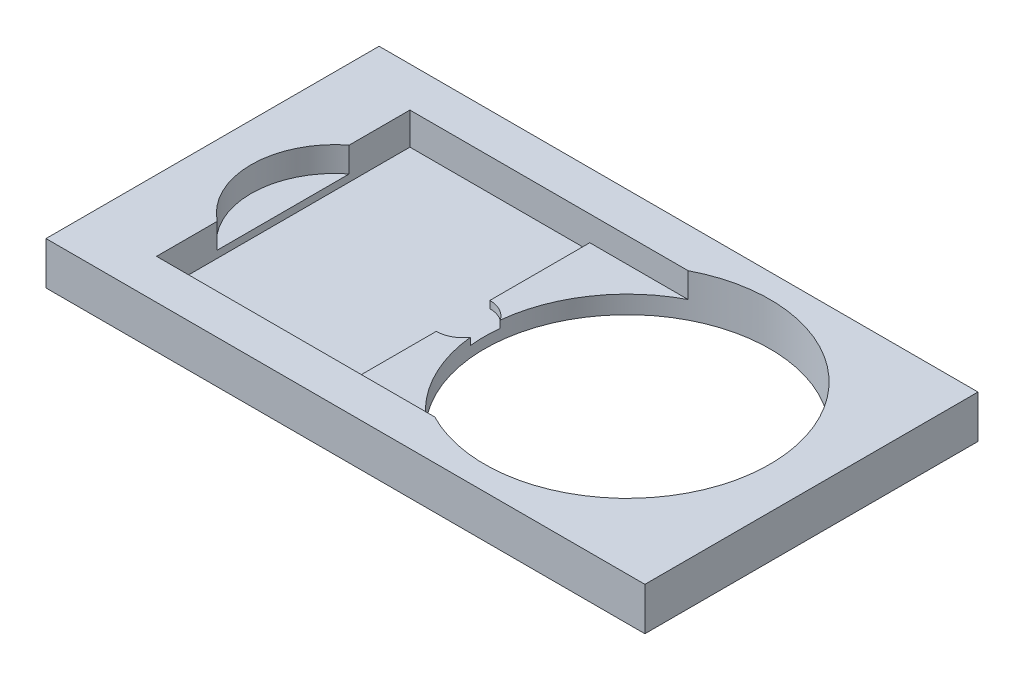
ISO-10303-21;
HEADER;
FILE_DESCRIPTION(('STEP AP214'),'2;1');
FILE_NAME('part.step','',(''),(''),'','','');
FILE_SCHEMA(('AUTOMOTIVE_DESIGN { 1 0 10303 214 1 1 1 1 }'));
ENDSEC;
DATA;
#1=APPLICATION_CONTEXT('core data for automotive mechanical design processes');
#2=APPLICATION_PROTOCOL_DEFINITION('international standard','automotive_design',2000,#1);
#3=PRODUCT_CONTEXT('',#1,'mechanical');
#4=PRODUCT('Part','Part','',(#3));
#5=PRODUCT_RELATED_PRODUCT_CATEGORY('part','',(#4));
#6=PRODUCT_DEFINITION_FORMATION('','',#4);
#7=PRODUCT_DEFINITION_CONTEXT('part definition',#1,'design');
#8=PRODUCT_DEFINITION('design','',#6,#7);
#9=PRODUCT_DEFINITION_SHAPE('','',#8);
#10=(LENGTH_UNIT() NAMED_UNIT(*) SI_UNIT(.MILLI.,.METRE.));
#11=(NAMED_UNIT(*) PLANE_ANGLE_UNIT() SI_UNIT($,.RADIAN.));
#12=(NAMED_UNIT(*) SI_UNIT($,.STERADIAN.) SOLID_ANGLE_UNIT());
#13=UNCERTAINTY_MEASURE_WITH_UNIT(LENGTH_MEASURE(1.E-05),#10,'distance_accuracy_value','');
#14=(GEOMETRIC_REPRESENTATION_CONTEXT(3) GLOBAL_UNCERTAINTY_ASSIGNED_CONTEXT((#13)) GLOBAL_UNIT_ASSIGNED_CONTEXT((#10,
#11,#12)) REPRESENTATION_CONTEXT('',''));
#15=CARTESIAN_POINT('',(0.,0.,0.));
#16=DIRECTION('',(0.,0.,1.));
#17=DIRECTION('',(1.,0.,0.));
#18=AXIS2_PLACEMENT_3D('',#15,#16,#17);
#19=CARTESIAN_POINT('',(0.,3.,0.));
#20=DIRECTION('',(0.,1.,0.));
#21=DIRECTION('',(0.,0.,1.));
#22=AXIS2_PLACEMENT_3D('',#19,#20,#21);
#23=PLANE('',#22);
#24=DIRECTION('',(-1.,0.,0.));
#25=VECTOR('',#24,1.);
#26=CARTESIAN_POINT('',(-10.1000000000001,3.00000000000001,-8.87500000000001));
#27=LINE('',#26,#25);
#28=CARTESIAN_POINT('',(-4.60807714779167,3.00000000000001,-8.875));
#29=VERTEX_POINT('',#28);
#30=CARTESIAN_POINT('',(-24.1000000000001,3.00000000000001,-8.87500000000001));
#31=VERTEX_POINT('',#30);
#32=EDGE_CURVE('E219',#29,#31,#27,.T.);
#33=ORIENTED_EDGE('',*,*,#32,.F.);
#34=CARTESIAN_POINT('',(0.,3.,0.));
#35=DIRECTION('',(0.,1.,0.));
#36=DIRECTION('',(0.,0.,1.));
#37=AXIS2_PLACEMENT_3D('',#34,#35,#36);
#38=CIRCLE('',#37,10.);
#39=CARTESIAN_POINT('',(-4.60807714779169,3.00000000000001,8.875));
#40=VERTEX_POINT('',#39);
#41=EDGE_CURVE('E254',#40,#29,#38,.T.);
#42=ORIENTED_EDGE('',*,*,#41,.F.);
#43=DIRECTION('',(-1.,0.,0.));
#44=VECTOR('',#43,1.);
#45=CARTESIAN_POINT('',(-10.1000000000001,3.00000000000001,8.875));
#46=LINE('',#45,#44);
#47=CARTESIAN_POINT('',(-24.1000000000001,3.00000000000001,8.87499999999999));
#48=VERTEX_POINT('',#47);
#49=EDGE_CURVE('E230',#40,#48,#46,.T.);
#50=ORIENTED_EDGE('',*,*,#49,.T.);
#51=DIRECTION('',(0.,0.,-1.));
#52=VECTOR('',#51,1.);
#53=CARTESIAN_POINT('',(-24.1000000000001,3.00000000000001,0.));
#54=LINE('',#53,#52);
#55=CARTESIAN_POINT('',(-24.1000000000001,3.00000000000001,4.62499999999999));
#56=VERTEX_POINT('',#55);
#57=EDGE_CURVE('E233',#48,#56,#54,.T.);
#58=ORIENTED_EDGE('',*,*,#57,.T.);
#59=CARTESIAN_POINT('',(-20.4715277777778,3.00000000000001,0.));
#60=DIRECTION('',(0.,-1.,0.));
#61=DIRECTION('',(-1.,0.,0.));
#62=AXIS2_PLACEMENT_3D('',#59,#60,#61);
#63=CIRCLE('',#62,5.87847222222222);
#64=CARTESIAN_POINT('',(-24.1000000000001,3.00000000000001,-4.62500000000001));
#65=VERTEX_POINT('',#64);
#66=EDGE_CURVE('E236',#65,#56,#63,.F.);
#67=ORIENTED_EDGE('',*,*,#66,.F.);
#68=DIRECTION('',(0.,0.,-1.));
#69=VECTOR('',#68,1.);
#70=CARTESIAN_POINT('',(-24.1000000000001,3.00000000000001,0.));
#71=LINE('',#70,#69);
#72=EDGE_CURVE('E223',#65,#31,#71,.T.);
#73=ORIENTED_EDGE('',*,*,#72,.T.);
#74=EDGE_LOOP('',(#33,#42,#50,#58,#67,#73));
#75=FACE_BOUND('',#74,.T.);
#76=DIRECTION('',(-1.,0.,0.));
#77=VECTOR('',#76,1.);
#78=CARTESIAN_POINT('',(0.,3.,-11.667703006113));
#79=LINE('',#78,#77);
#80=CARTESIAN_POINT('',(12.9045820912385,3.,-11.667703006113));
#81=VERTEX_POINT('',#80);
#82=CARTESIAN_POINT('',(-29.0510789574431,3.,-11.667703006113));
#83=VERTEX_POINT('',#82);
#84=EDGE_CURVE('E156',#81,#83,#79,.T.);
#85=ORIENTED_EDGE('',*,*,#84,.T.);
#86=DIRECTION('',(0.,0.,1.));
#87=VECTOR('',#86,1.);
#88=CARTESIAN_POINT('',(-29.0510789574431,3.,0.));
#89=LINE('',#88,#87);
#90=CARTESIAN_POINT('',(-29.0510789574431,3.,11.667703006113));
#91=VERTEX_POINT('',#90);
#92=EDGE_CURVE('E181',#83,#91,#89,.T.);
#93=ORIENTED_EDGE('',*,*,#92,.T.);
#94=DIRECTION('',(1.,0.,0.));
#95=VECTOR('',#94,1.);
#96=CARTESIAN_POINT('',(0.,3.,11.667703006113));
#97=LINE('',#96,#95);
#98=CARTESIAN_POINT('',(12.9045820912385,3.,11.667703006113));
#99=VERTEX_POINT('',#98);
#100=EDGE_CURVE('E173',#91,#99,#97,.T.);
#101=ORIENTED_EDGE('',*,*,#100,.T.);
#102=DIRECTION('',(0.,0.,-1.));
#103=VECTOR('',#102,1.);
#104=CARTESIAN_POINT('',(12.9045820912385,3.,0.));
#105=LINE('',#104,#103);
#106=EDGE_CURVE('E178',#99,#81,#105,.T.);
#107=ORIENTED_EDGE('',*,*,#106,.T.);
#108=EDGE_LOOP('',(#85,#93,#101,#107));
#109=FACE_BOUND('',#108,.T.);
#110=ADVANCED_FACE('F35',(#75,#109),#23,.T.);
#111=CARTESIAN_POINT('',(0.,0.,0.));
#112=DIRECTION('',(0.,1.,0.));
#113=DIRECTION('',(0.,0.,1.));
#114=AXIS2_PLACEMENT_3D('',#111,#112,#113);
#115=PLANE('',#114);
#116=CARTESIAN_POINT('',(0.,0.,0.));
#117=DIRECTION('',(0.,1.,0.));
#118=DIRECTION('',(0.,0.,1.));
#119=AXIS2_PLACEMENT_3D('',#116,#117,#118);
#120=CIRCLE('',#119,10.);
#121=CARTESIAN_POINT('',(0.,0.,10.));
#122=VERTEX_POINT('',#121);
#123=EDGE_CURVE('E253',#122,#122,#120,.T.);
#124=ORIENTED_EDGE('',*,*,#123,.T.);
#125=EDGE_LOOP('',(#124));
#126=FACE_BOUND('',#125,.T.);
#127=DIRECTION('',(0.,0.,1.));
#128=VECTOR('',#127,1.);
#129=CARTESIAN_POINT('',(-29.0510789574431,0.,-11.667703006113));
#130=LINE('',#129,#128);
#131=CARTESIAN_POINT('',(-29.0510789574431,0.,-11.667703006113));
#132=VERTEX_POINT('',#131);
#133=CARTESIAN_POINT('',(-29.0510789574431,0.,11.667703006113));
#134=VERTEX_POINT('',#133);
#135=EDGE_CURVE('E58',#132,#134,#130,.T.);
#136=ORIENTED_EDGE('',*,*,#135,.F.);
#137=DIRECTION('',(-1.,0.,0.));
#138=VECTOR('',#137,1.);
#139=CARTESIAN_POINT('',(12.9045820912385,0.,-11.667703006113));
#140=LINE('',#139,#138);
#141=CARTESIAN_POINT('',(12.9045820912385,0.,-11.667703006113));
#142=VERTEX_POINT('',#141);
#143=EDGE_CURVE('E154',#142,#132,#140,.T.);
#144=ORIENTED_EDGE('',*,*,#143,.F.);
#145=DIRECTION('',(0.,0.,-1.));
#146=VECTOR('',#145,1.);
#147=CARTESIAN_POINT('',(12.9045820912385,0.,-11.667703006113));
#148=LINE('',#147,#146);
#149=CARTESIAN_POINT('',(12.9045820912385,0.,11.667703006113));
#150=VERTEX_POINT('',#149);
#151=EDGE_CURVE('E162',#150,#142,#148,.T.);
#152=ORIENTED_EDGE('',*,*,#151,.F.);
#153=DIRECTION('',(1.,0.,0.));
#154=VECTOR('',#153,1.);
#155=CARTESIAN_POINT('',(12.9045820912385,0.,11.667703006113));
#156=LINE('',#155,#154);
#157=EDGE_CURVE('E166',#134,#150,#156,.T.);
#158=ORIENTED_EDGE('',*,*,#157,.F.);
#159=EDGE_LOOP('',(#136,#144,#152,#158));
#160=FACE_BOUND('',#159,.T.);
#161=ADVANCED_FACE('F37',(#126,#160),#115,.F.);
#162=CARTESIAN_POINT('',(0.,3.,0.));
#163=DIRECTION('',(0.,-1.,0.));
#164=DIRECTION('',(0.,0.,-1.));
#165=AXIS2_PLACEMENT_3D('',#162,#163,#164);
#166=CYLINDRICAL_SURFACE('',#165,10.);
#167=DIRECTION('',(0.,-1.,0.));
#168=VECTOR('',#167,1.);
#169=CARTESIAN_POINT('',(-4.60807714779167,3.,-8.87500000000001));
#170=LINE('',#169,#168);
#171=CARTESIAN_POINT('',(-4.60807714779167,1.25000000000001,-8.875));
#172=VERTEX_POINT('',#171);
#173=EDGE_CURVE('E11',#172,#29,#170,.F.);
#174=ORIENTED_EDGE('',*,*,#173,.F.);
#175=CARTESIAN_POINT('',(0.,1.25000000000001,0.));
#176=DIRECTION('',(0.,-1.,0.));
#177=DIRECTION('',(1.,0.,0.));
#178=AXIS2_PLACEMENT_3D('',#175,#176,#177);
#179=CIRCLE('',#178,10.);
#180=CARTESIAN_POINT('',(-9.94497282608697,1.25000000000001,-1.04762373416787));
#181=VERTEX_POINT('',#180);
#182=EDGE_CURVE('E266',#181,#172,#179,.T.);
#183=ORIENTED_EDGE('',*,*,#182,.F.);
#184=DIRECTION('',(0.,1.,0.));
#185=VECTOR('',#184,1.);
#186=CARTESIAN_POINT('',(-9.94497282608697,1.00000000000001,-1.04762373416787));
#187=LINE('',#186,#185);
#188=CARTESIAN_POINT('',(-9.94497282608697,0.750000000000011,-1.04762373416787));
#189=VERTEX_POINT('',#188);
#190=EDGE_CURVE('E263',#181,#189,#187,.F.);
#191=ORIENTED_EDGE('',*,*,#190,.T.);
#192=CARTESIAN_POINT('',(0.,0.750000000000012,0.));
#193=DIRECTION('',(0.,-1.,0.));
#194=DIRECTION('',(1.,0.,0.));
#195=AXIS2_PLACEMENT_3D('',#192,#193,#194);
#196=CIRCLE('',#195,10.);
#197=CARTESIAN_POINT('',(-9.94497282608697,0.750000000000011,1.04762373416786));
#198=VERTEX_POINT('',#197);
#199=EDGE_CURVE('E256',#198,#189,#196,.T.);
#200=ORIENTED_EDGE('',*,*,#199,.F.);
#201=DIRECTION('',(0.,1.,0.));
#202=VECTOR('',#201,1.);
#203=CARTESIAN_POINT('',(-9.94497282608697,1.00000000000001,1.04762373416787));
#204=LINE('',#203,#202);
#205=CARTESIAN_POINT('',(-9.94497282608697,1.25000000000001,1.04762373416787));
#206=VERTEX_POINT('',#205);
#207=EDGE_CURVE('E260',#198,#206,#204,.T.);
#208=ORIENTED_EDGE('',*,*,#207,.T.);
#209=CARTESIAN_POINT('',(-4.60807714779169,1.25000000000001,8.875));
#210=VERTEX_POINT('',#209);
#211=EDGE_CURVE('E267',#210,#206,#179,.T.);
#212=ORIENTED_EDGE('',*,*,#211,.F.);
#213=DIRECTION('',(0.,-1.,0.));
#214=VECTOR('',#213,1.);
#215=CARTESIAN_POINT('',(-4.60807714779169,3.,8.875));
#216=LINE('',#215,#214);
#217=EDGE_CURVE('E43',#210,#40,#216,.F.);
#218=ORIENTED_EDGE('',*,*,#217,.T.);
#219=ORIENTED_EDGE('',*,*,#41,.T.);
#220=EDGE_LOOP('',(#174,#183,#191,#200,#208,#212,#218,#219));
#221=FACE_BOUND('',#220,.T.);
#222=ORIENTED_EDGE('',*,*,#123,.F.);
#223=EDGE_LOOP('',(#222));
#224=FACE_BOUND('',#223,.T.);
#225=ADVANCED_FACE('F282',(#221,#224),#166,.F.);
#226=CARTESIAN_POINT('',(-10.1000000000001,1.25000000000001,0.));
#227=DIRECTION('',(0.,-1.,0.));
#228=DIRECTION('',(-1.,0.,0.));
#229=AXIS2_PLACEMENT_3D('',#226,#227,#228);
#230=PLANE('',#229);
#231=ORIENTED_EDGE('',*,*,#211,.T.);
#232=CARTESIAN_POINT('',(-11.5000000000001,1.25000000000001,0.));
#233=DIRECTION('',(0.,-1.,0.));
#234=DIRECTION('',(-1.,0.,0.));
#235=AXIS2_PLACEMENT_3D('',#232,#233,#234);
#236=CIRCLE('',#235,1.875);
#237=CARTESIAN_POINT('',(-11.5000000000001,1.25000000000001,1.875));
#238=VERTEX_POINT('',#237);
#239=EDGE_CURVE('E184',#206,#238,#236,.T.);
#240=ORIENTED_EDGE('',*,*,#239,.T.);
#241=DIRECTION('',(0.,0.,1.));
#242=VECTOR('',#241,1.);
#243=CARTESIAN_POINT('',(-11.5000000000001,1.25000000000001,0.));
#244=LINE('',#243,#242);
#245=CARTESIAN_POINT('',(-11.5000000000001,1.25000000000001,8.875));
#246=VERTEX_POINT('',#245);
#247=EDGE_CURVE('E203',#238,#246,#244,.T.);
#248=ORIENTED_EDGE('',*,*,#247,.T.);
#249=DIRECTION('',(-1.,0.,0.));
#250=VECTOR('',#249,1.);
#251=CARTESIAN_POINT('',(-10.1000000000001,1.25000000000001,8.875));
#252=LINE('',#251,#250);
#253=EDGE_CURVE('E222',#210,#246,#252,.T.);
#254=ORIENTED_EDGE('',*,*,#253,.F.);
#255=EDGE_LOOP('',(#231,#240,#248,#254));
#256=FACE_BOUND('',#255,.T.);
#257=ADVANCED_FACE('F274',(#256),#230,.F.);
#258=CARTESIAN_POINT('',(-11.5000000000001,0.750000000000011,0.));
#259=DIRECTION('',(0.,1.,0.));
#260=DIRECTION('',(1.,0.,0.));
#261=AXIS2_PLACEMENT_3D('',#258,#259,#260);
#262=CYLINDRICAL_SURFACE('',#261,1.875);
#263=CARTESIAN_POINT('',(-11.5000000000001,1.25000000000001,-1.875));
#264=VERTEX_POINT('',#263);
#265=EDGE_CURVE('E200',#264,#181,#236,.T.);
#266=ORIENTED_EDGE('',*,*,#265,.F.);
#267=DIRECTION('',(0.,1.,0.));
#268=VECTOR('',#267,1.);
#269=CARTESIAN_POINT('',(-11.5000000000001,0.750000000000011,-1.875));
#270=LINE('',#269,#268);
#271=CARTESIAN_POINT('',(-11.5000000000001,0.750000000000011,-1.875));
#272=VERTEX_POINT('',#271);
#273=EDGE_CURVE('E207',#272,#264,#270,.T.);
#274=ORIENTED_EDGE('',*,*,#273,.F.);
#275=CARTESIAN_POINT('',(-11.5000000000001,0.750000000000011,0.));
#276=DIRECTION('',(0.,-1.,0.));
#277=DIRECTION('',(-1.,0.,0.));
#278=AXIS2_PLACEMENT_3D('',#275,#276,#277);
#279=CIRCLE('',#278,1.875);
#280=EDGE_CURVE('E185',#272,#189,#279,.T.);
#281=ORIENTED_EDGE('',*,*,#280,.T.);
#282=ORIENTED_EDGE('',*,*,#190,.F.);
#283=EDGE_LOOP('',(#266,#274,#281,#282));
#284=FACE_BOUND('',#283,.T.);
#285=ADVANCED_FACE('F293',(#284),#262,.F.);
#286=CARTESIAN_POINT('',(-20.4715277777778,1.25000000000001,0.));
#287=DIRECTION('',(0.,-1.,0.));
#288=DIRECTION('',(-1.,0.,0.));
#289=AXIS2_PLACEMENT_3D('',#286,#287,#288);
#290=CIRCLE('',#289,5.87847222222222);
#291=CARTESIAN_POINT('',(-24.1000000000001,1.25000000000001,-4.62500000000001));
#292=VERTEX_POINT('',#291);
#293=CARTESIAN_POINT('',(-24.1000000000001,1.25000000000001,4.62499999999999));
#294=VERTEX_POINT('',#293);
#295=EDGE_CURVE('E225',#292,#294,#290,.F.);
#296=ORIENTED_EDGE('',*,*,#295,.T.);
#297=DIRECTION('',(0.,0.,1.));
#298=VECTOR('',#297,1.);
#299=CARTESIAN_POINT('',(-24.1000000000001,1.25000000000001,0.));
#300=LINE('',#299,#298);
#301=EDGE_CURVE('E251',#292,#294,#300,.T.);
#302=ORIENTED_EDGE('',*,*,#301,.F.);
#303=EDGE_LOOP('',(#296,#302));
#304=FACE_BOUND('',#303,.T.);
#305=ADVANCED_FACE('F343',(#304),#230,.F.);
#306=ORIENTED_EDGE('',*,*,#182,.T.);
#307=DIRECTION('',(-1.,0.,0.));
#308=VECTOR('',#307,1.);
#309=CARTESIAN_POINT('',(-10.1000000000001,1.25000000000001,-8.87500000000001));
#310=LINE('',#309,#308);
#311=CARTESIAN_POINT('',(-11.5000000000001,1.25000000000001,-8.87500000000001));
#312=VERTEX_POINT('',#311);
#313=EDGE_CURVE('E220',#172,#312,#310,.T.);
#314=ORIENTED_EDGE('',*,*,#313,.T.);
#315=EDGE_CURVE('E206',#312,#264,#244,.T.);
#316=ORIENTED_EDGE('',*,*,#315,.T.);
#317=ORIENTED_EDGE('',*,*,#265,.T.);
#318=EDGE_LOOP('',(#306,#314,#316,#317));
#319=FACE_BOUND('',#318,.T.);
#320=ADVANCED_FACE('F335',(#319),#230,.F.);
#321=CARTESIAN_POINT('',(-10.1000000000001,1.25000000000001,-8.87500000000001));
#322=DIRECTION('',(0.,0.,-1.));
#323=DIRECTION('',(0.,1.,0.));
#324=AXIS2_PLACEMENT_3D('',#321,#322,#323);
#325=PLANE('',#324);
#326=ORIENTED_EDGE('',*,*,#173,.T.);
#327=ORIENTED_EDGE('',*,*,#32,.T.);
#328=DIRECTION('',(0.,1.,0.));
#329=VECTOR('',#328,1.);
#330=CARTESIAN_POINT('',(-24.1000000000001,1.25000000000001,-8.87500000000001));
#331=LINE('',#330,#329);
#332=CARTESIAN_POINT('',(-24.1000000000001,0.750000000000008,-8.87500000000001));
#333=VERTEX_POINT('',#332);
#334=EDGE_CURVE('E228',#333,#31,#331,.T.);
#335=ORIENTED_EDGE('',*,*,#334,.F.);
#336=DIRECTION('',(1.,0.,0.));
#337=VECTOR('',#336,1.);
#338=CARTESIAN_POINT('',(-10.1000000000001,0.750000000000011,-8.87500000000001));
#339=LINE('',#338,#337);
#340=CARTESIAN_POINT('',(-11.5000000000001,0.750000000000011,-8.87500000000001));
#341=VERTEX_POINT('',#340);
#342=EDGE_CURVE('E198',#333,#341,#339,.T.);
#343=ORIENTED_EDGE('',*,*,#342,.T.);
#344=DIRECTION('',(0.,1.,0.));
#345=VECTOR('',#344,1.);
#346=CARTESIAN_POINT('',(-11.5000000000001,0.750000000000011,-8.87500000000001));
#347=LINE('',#346,#345);
#348=EDGE_CURVE('E210',#341,#312,#347,.T.);
#349=ORIENTED_EDGE('',*,*,#348,.T.);
#350=ORIENTED_EDGE('',*,*,#313,.F.);
#351=EDGE_LOOP('',(#326,#327,#335,#343,#349,#350));
#352=FACE_BOUND('',#351,.T.);
#353=ADVANCED_FACE('F302',(#352),#325,.F.);
#354=CARTESIAN_POINT('',(-10.1000000000001,1.25000000000001,8.875));
#355=DIRECTION('',(0.,0.,-1.));
#356=DIRECTION('',(0.,1.,0.));
#357=AXIS2_PLACEMENT_3D('',#354,#355,#356);
#358=PLANE('',#357);
#359=ORIENTED_EDGE('',*,*,#253,.T.);
#360=DIRECTION('',(0.,1.,0.));
#361=VECTOR('',#360,1.);
#362=CARTESIAN_POINT('',(-11.5000000000001,0.750000000000011,8.875));
#363=LINE('',#362,#361);
#364=CARTESIAN_POINT('',(-11.5000000000001,0.750000000000011,8.875));
#365=VERTEX_POINT('',#364);
#366=EDGE_CURVE('E213',#365,#246,#363,.T.);
#367=ORIENTED_EDGE('',*,*,#366,.F.);
#368=DIRECTION('',(-1.,0.,0.));
#369=VECTOR('',#368,1.);
#370=CARTESIAN_POINT('',(-10.1000000000001,0.750000000000011,8.875));
#371=LINE('',#370,#369);
#372=CARTESIAN_POINT('',(-24.1000000000001,0.750000000000011,8.87499999999999));
#373=VERTEX_POINT('',#372);
#374=EDGE_CURVE('E191',#365,#373,#371,.T.);
#375=ORIENTED_EDGE('',*,*,#374,.T.);
#376=DIRECTION('',(0.,1.,0.));
#377=VECTOR('',#376,1.);
#378=CARTESIAN_POINT('',(-24.1000000000001,1.25000000000001,8.87499999999999));
#379=LINE('',#378,#377);
#380=EDGE_CURVE('E248',#373,#48,#379,.T.);
#381=ORIENTED_EDGE('',*,*,#380,.T.);
#382=ORIENTED_EDGE('',*,*,#49,.F.);
#383=ORIENTED_EDGE('',*,*,#217,.F.);
#384=EDGE_LOOP('',(#359,#367,#375,#381,#382,#383));
#385=FACE_BOUND('',#384,.T.);
#386=ADVANCED_FACE('F310',(#385),#358,.T.);
#387=CARTESIAN_POINT('',(-24.1000000000001,1.25000000000001,0.));
#388=DIRECTION('',(1.,0.,0.));
#389=DIRECTION('',(0.,-1.,0.));
#390=AXIS2_PLACEMENT_3D('',#387,#388,#389);
#391=PLANE('',#390);
#392=ORIENTED_EDGE('',*,*,#57,.F.);
#393=ORIENTED_EDGE('',*,*,#380,.F.);
#394=DIRECTION('',(0.,0.,-1.));
#395=VECTOR('',#394,1.);
#396=CARTESIAN_POINT('',(-24.1000000000001,0.750000000000008,0.));
#397=LINE('',#396,#395);
#398=EDGE_CURVE('E195',#373,#333,#397,.T.);
#399=ORIENTED_EDGE('',*,*,#398,.T.);
#400=ORIENTED_EDGE('',*,*,#334,.T.);
#401=ORIENTED_EDGE('',*,*,#72,.F.);
#402=DIRECTION('',(0.,1.,0.));
#403=VECTOR('',#402,1.);
#404=CARTESIAN_POINT('',(-24.1000000000001,1.25000000000001,-4.62500000000001));
#405=LINE('',#404,#403);
#406=EDGE_CURVE('E242',#292,#65,#405,.T.);
#407=ORIENTED_EDGE('',*,*,#406,.F.);
#408=ORIENTED_EDGE('',*,*,#301,.T.);
#409=DIRECTION('',(0.,1.,0.));
#410=VECTOR('',#409,1.);
#411=CARTESIAN_POINT('',(-24.1000000000001,1.25000000000001,4.62499999999999));
#412=LINE('',#411,#410);
#413=EDGE_CURVE('E245',#294,#56,#412,.T.);
#414=ORIENTED_EDGE('',*,*,#413,.T.);
#415=EDGE_LOOP('',(#392,#393,#399,#400,#401,#407,#408,#414));
#416=FACE_BOUND('',#415,.T.);
#417=ADVANCED_FACE('F306',(#416),#391,.T.);
#418=CARTESIAN_POINT('',(-20.4715277777778,1.25000000000001,0.));
#419=DIRECTION('',(0.,1.,0.));
#420=DIRECTION('',(1.,0.,0.));
#421=AXIS2_PLACEMENT_3D('',#418,#419,#420);
#422=CYLINDRICAL_SURFACE('',#421,5.87847222222222);
#423=ORIENTED_EDGE('',*,*,#66,.T.);
#424=ORIENTED_EDGE('',*,*,#413,.F.);
#425=ORIENTED_EDGE('',*,*,#295,.F.);
#426=ORIENTED_EDGE('',*,*,#406,.T.);
#427=EDGE_LOOP('',(#423,#424,#425,#426));
#428=FACE_BOUND('',#427,.T.);
#429=ADVANCED_FACE('F319',(#428),#422,.F.);
#430=CARTESIAN_POINT('',(-11.5000000000001,0.750000000000011,1.875));
#431=VERTEX_POINT('',#430);
#432=EDGE_CURVE('E189',#198,#431,#279,.T.);
#433=ORIENTED_EDGE('',*,*,#432,.T.);
#434=DIRECTION('',(0.,1.,0.));
#435=VECTOR('',#434,1.);
#436=CARTESIAN_POINT('',(-11.5000000000001,0.750000000000011,1.875));
#437=LINE('',#436,#435);
#438=EDGE_CURVE('E216',#431,#238,#437,.T.);
#439=ORIENTED_EDGE('',*,*,#438,.T.);
#440=ORIENTED_EDGE('',*,*,#239,.F.);
#441=ORIENTED_EDGE('',*,*,#207,.F.);
#442=EDGE_LOOP('',(#433,#439,#440,#441));
#443=FACE_BOUND('',#442,.T.);
#444=ADVANCED_FACE('F277',(#443),#262,.F.);
#445=CARTESIAN_POINT('',(-11.5000000000001,0.750000000000011,0.));
#446=DIRECTION('',(-1.,0.,0.));
#447=DIRECTION('',(0.,0.,1.));
#448=AXIS2_PLACEMENT_3D('',#445,#446,#447);
#449=PLANE('',#448);
#450=ORIENTED_EDGE('',*,*,#247,.F.);
#451=ORIENTED_EDGE('',*,*,#438,.F.);
#452=DIRECTION('',(0.,0.,1.));
#453=VECTOR('',#452,1.);
#454=CARTESIAN_POINT('',(-11.5000000000001,0.750000000000011,0.));
#455=LINE('',#454,#453);
#456=EDGE_CURVE('E188',#431,#365,#455,.T.);
#457=ORIENTED_EDGE('',*,*,#456,.T.);
#458=ORIENTED_EDGE('',*,*,#366,.T.);
#459=EDGE_LOOP('',(#450,#451,#457,#458));
#460=FACE_BOUND('',#459,.T.);
#461=ADVANCED_FACE('F312',(#460),#449,.T.);
#462=ORIENTED_EDGE('',*,*,#315,.F.);
#463=ORIENTED_EDGE('',*,*,#348,.F.);
#464=EDGE_CURVE('E192',#341,#272,#455,.T.);
#465=ORIENTED_EDGE('',*,*,#464,.T.);
#466=ORIENTED_EDGE('',*,*,#273,.T.);
#467=EDGE_LOOP('',(#462,#463,#465,#466));
#468=FACE_BOUND('',#467,.T.);
#469=ADVANCED_FACE('F296',(#468),#449,.T.);
#470=CARTESIAN_POINT('',(-10.1000000000001,0.750000000000011,0.));
#471=DIRECTION('',(0.,-1.,0.));
#472=DIRECTION('',(-1.,0.,0.));
#473=AXIS2_PLACEMENT_3D('',#470,#471,#472);
#474=PLANE('',#473);
#475=ORIENTED_EDGE('',*,*,#199,.T.);
#476=ORIENTED_EDGE('',*,*,#280,.F.);
#477=ORIENTED_EDGE('',*,*,#464,.F.);
#478=ORIENTED_EDGE('',*,*,#342,.F.);
#479=ORIENTED_EDGE('',*,*,#398,.F.);
#480=ORIENTED_EDGE('',*,*,#374,.F.);
#481=ORIENTED_EDGE('',*,*,#456,.F.);
#482=ORIENTED_EDGE('',*,*,#432,.F.);
#483=EDGE_LOOP('',(#475,#476,#477,#478,#479,#480,#481,#482));
#484=FACE_BOUND('',#483,.T.);
#485=ADVANCED_FACE('F287',(#484),#474,.F.);
#486=CARTESIAN_POINT('',(-29.0510789574431,0.,-11.667703006113));
#487=DIRECTION('',(-1.,0.,0.));
#488=DIRECTION('',(0.,0.,1.));
#489=AXIS2_PLACEMENT_3D('',#486,#487,#488);
#490=PLANE('',#489);
#491=DIRECTION('',(0.,1.,0.));
#492=VECTOR('',#491,1.);
#493=CARTESIAN_POINT('',(-29.0510789574431,0.,-11.667703006113));
#494=LINE('',#493,#492);
#495=EDGE_CURVE('E159',#132,#83,#494,.T.);
#496=ORIENTED_EDGE('',*,*,#495,.F.);
#497=ORIENTED_EDGE('',*,*,#135,.T.);
#498=DIRECTION('',(0.,1.,0.));
#499=VECTOR('',#498,1.);
#500=CARTESIAN_POINT('',(-29.0510789574431,0.,11.667703006113));
#501=LINE('',#500,#499);
#502=EDGE_CURVE('E168',#134,#91,#501,.T.);
#503=ORIENTED_EDGE('',*,*,#502,.T.);
#504=ORIENTED_EDGE('',*,*,#92,.F.);
#505=EDGE_LOOP('',(#496,#497,#503,#504));
#506=FACE_BOUND('',#505,.T.);
#507=ADVANCED_FACE('F452',(#506),#490,.T.);
#508=CARTESIAN_POINT('',(12.9045820912385,0.,-11.667703006113));
#509=DIRECTION('',(0.,0.,-1.));
#510=DIRECTION('',(-1.,0.,0.));
#511=AXIS2_PLACEMENT_3D('',#508,#509,#510);
#512=PLANE('',#511);
#513=DIRECTION('',(0.,1.,0.));
#514=VECTOR('',#513,1.);
#515=CARTESIAN_POINT('',(12.9045820912385,0.,-11.667703006113));
#516=LINE('',#515,#514);
#517=EDGE_CURVE('E149',#142,#81,#516,.T.);
#518=ORIENTED_EDGE('',*,*,#517,.F.);
#519=ORIENTED_EDGE('',*,*,#143,.T.);
#520=ORIENTED_EDGE('',*,*,#495,.T.);
#521=ORIENTED_EDGE('',*,*,#84,.F.);
#522=EDGE_LOOP('',(#518,#519,#520,#521));
#523=FACE_BOUND('',#522,.T.);
#524=ADVANCED_FACE('F151',(#523),#512,.T.);
#525=CARTESIAN_POINT('',(12.9045820912385,0.,-11.667703006113));
#526=DIRECTION('',(1.,0.,0.));
#527=DIRECTION('',(0.,0.,-1.));
#528=AXIS2_PLACEMENT_3D('',#525,#526,#527);
#529=PLANE('',#528);
#530=DIRECTION('',(0.,1.,0.));
#531=VECTOR('',#530,1.);
#532=CARTESIAN_POINT('',(12.9045820912385,0.,11.667703006113));
#533=LINE('',#532,#531);
#534=EDGE_CURVE('E50',#150,#99,#533,.T.);
#535=ORIENTED_EDGE('',*,*,#534,.F.);
#536=ORIENTED_EDGE('',*,*,#151,.T.);
#537=ORIENTED_EDGE('',*,*,#517,.T.);
#538=ORIENTED_EDGE('',*,*,#106,.F.);
#539=EDGE_LOOP('',(#535,#536,#537,#538));
#540=FACE_BOUND('',#539,.T.);
#541=ADVANCED_FACE('F163',(#540),#529,.T.);
#542=CARTESIAN_POINT('',(12.9045820912385,0.,11.667703006113));
#543=DIRECTION('',(0.,0.,1.));
#544=DIRECTION('',(1.,0.,0.));
#545=AXIS2_PLACEMENT_3D('',#542,#543,#544);
#546=PLANE('',#545);
#547=ORIENTED_EDGE('',*,*,#502,.F.);
#548=ORIENTED_EDGE('',*,*,#157,.T.);
#549=ORIENTED_EDGE('',*,*,#534,.T.);
#550=ORIENTED_EDGE('',*,*,#100,.F.);
#551=EDGE_LOOP('',(#547,#548,#549,#550));
#552=FACE_BOUND('',#551,.T.);
#553=ADVANCED_FACE('F486',(#552),#546,.T.);
#554=CLOSED_SHELL('',(#110,#161,#225,#257,#285,#305,#320,#353,#386,#417,#429,#444,#461,#469,
#485,#507,#524,#541,#553));
#555=MANIFOLD_SOLID_BREP('B2',#554);
#556=ADVANCED_BREP_SHAPE_REPRESENTATION('',(#18,#555),#14);
#557=SHAPE_DEFINITION_REPRESENTATION(#9,#556);
ENDSEC;
END-ISO-10303-21;
